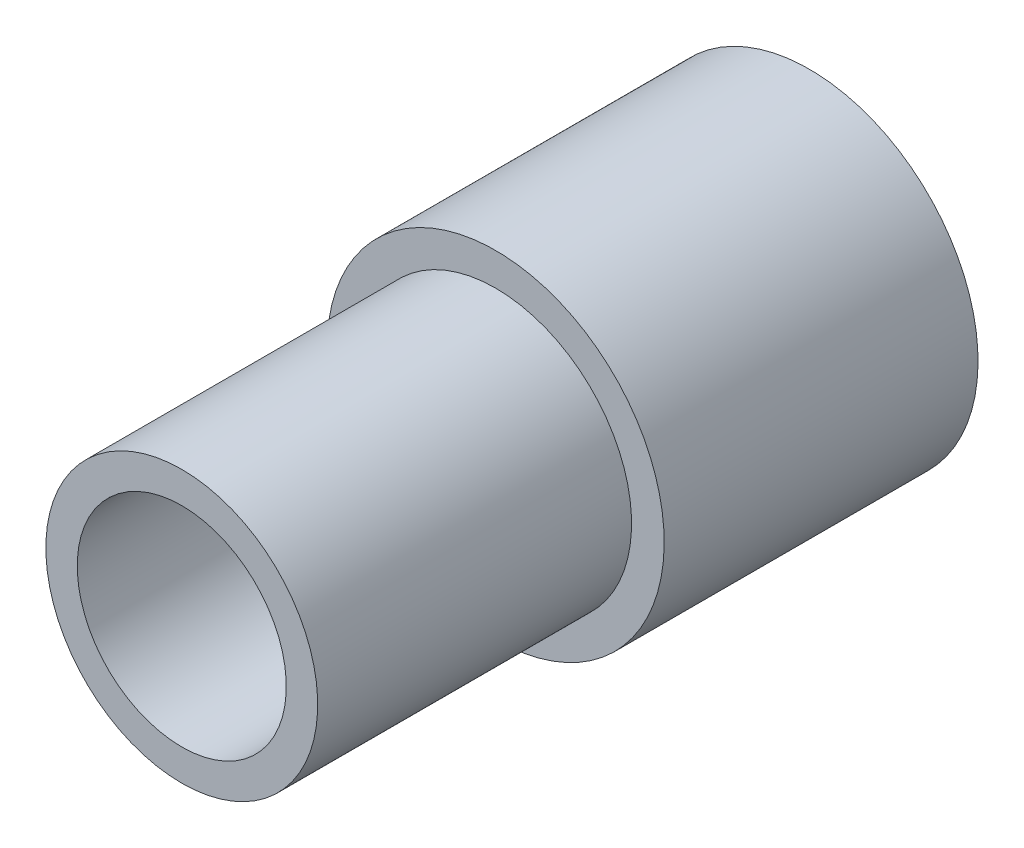
ISO-10303-21;
HEADER;
FILE_DESCRIPTION(('STEP AP214'),'2;1');
FILE_NAME('part.step','',(''),(''),'','','');
FILE_SCHEMA(('AUTOMOTIVE_DESIGN { 1 0 10303 214 1 1 1 1 }'));
ENDSEC;
DATA;
#1=APPLICATION_CONTEXT('core data for automotive mechanical design processes');
#2=APPLICATION_PROTOCOL_DEFINITION('international standard','automotive_design',2000,#1);
#3=PRODUCT_CONTEXT('',#1,'mechanical');
#4=PRODUCT('Part','Part','',(#3));
#5=PRODUCT_RELATED_PRODUCT_CATEGORY('part','',(#4));
#6=PRODUCT_DEFINITION_FORMATION('','',#4);
#7=PRODUCT_DEFINITION_CONTEXT('part definition',#1,'design');
#8=PRODUCT_DEFINITION('design','',#6,#7);
#9=PRODUCT_DEFINITION_SHAPE('','',#8);
#10=(LENGTH_UNIT() NAMED_UNIT(*) SI_UNIT(.MILLI.,.METRE.));
#11=(NAMED_UNIT(*) PLANE_ANGLE_UNIT() SI_UNIT($,.RADIAN.));
#12=(NAMED_UNIT(*) SI_UNIT($,.STERADIAN.) SOLID_ANGLE_UNIT());
#13=UNCERTAINTY_MEASURE_WITH_UNIT(LENGTH_MEASURE(1.E-05),#10,'distance_accuracy_value','');
#14=(GEOMETRIC_REPRESENTATION_CONTEXT(3) GLOBAL_UNCERTAINTY_ASSIGNED_CONTEXT((#13)) GLOBAL_UNIT_ASSIGNED_CONTEXT((#10,
#11,#12)) REPRESENTATION_CONTEXT('',''));
#15=CARTESIAN_POINT('',(0.,0.,0.));
#16=DIRECTION('',(0.,0.,1.));
#17=DIRECTION('',(1.,0.,0.));
#18=AXIS2_PLACEMENT_3D('',#15,#16,#17);
#19=CARTESIAN_POINT('',(0.,0.,-9.40475721120252));
#20=DIRECTION('',(0.,0.,1.));
#21=DIRECTION('',(0.,-1.,0.));
#22=AXIS2_PLACEMENT_3D('',#19,#20,#21);
#23=SPHERICAL_SURFACE('',#22,10.7033242137109);
#24=CARTESIAN_POINT('',(0.,0.,1.29856700250843));
#25=VERTEX_POINT('',#24);
#26=VERTEX_LOOP('',#25);
#27=FACE_BOUND('',#26,.T.);
#28=ADVANCED_FACE('F40',(#27),#23,.T.);
#29=CLOSED_SHELL('',(#28));
#30=MANIFOLD_SOLID_BREP('B2',#29);
#31=CARTESIAN_POINT('',(0.,11.,27.6550224338305));
#32=DIRECTION('',(0.,0.,-1.));
#33=DIRECTION('',(0.,1.,0.));
#34=AXIS2_PLACEMENT_3D('',#31,#32,#33);
#35=PLANE('',#34);
#36=CARTESIAN_POINT('',(0.,0.,27.6550224338305));
#37=DIRECTION('',(0.,0.,1.));
#38=DIRECTION('',(0.,-1.,0.));
#39=AXIS2_PLACEMENT_3D('',#36,#37,#38);
#40=CIRCLE('',#39,8.46);
#41=CARTESIAN_POINT('',(0.,-8.46,27.6550224338305));
#42=VERTEX_POINT('',#41);
#43=EDGE_CURVE('E39',#42,#42,#40,.T.);
#44=ORIENTED_EDGE('',*,*,#43,.F.);
#45=EDGE_LOOP('',(#44));
#46=FACE_BOUND('',#45,.T.);
#47=CARTESIAN_POINT('',(0.,0.,27.6550224338305));
#48=DIRECTION('',(0.,0.,1.));
#49=DIRECTION('',(0.,-1.,0.));
#50=AXIS2_PLACEMENT_3D('',#47,#48,#49);
#51=CIRCLE('',#50,11.);
#52=CARTESIAN_POINT('',(0.,-11.,27.6550224338305));
#53=VERTEX_POINT('',#52);
#54=EDGE_CURVE('E80',#53,#53,#51,.T.);
#55=ORIENTED_EDGE('',*,*,#54,.T.);
#56=EDGE_LOOP('',(#55));
#57=FACE_BOUND('',#56,.T.);
#58=ADVANCED_FACE('F52',(#46,#57),#35,.F.);
#59=CARTESIAN_POINT('',(0.,0.,27.6550224338305));
#60=DIRECTION('',(0.,0.,1.));
#61=DIRECTION('',(0.,-1.,0.));
#62=AXIS2_PLACEMENT_3D('',#59,#60,#61);
#63=CYLINDRICAL_SURFACE('',#62,8.46);
#64=CARTESIAN_POINT('',(0.,0.,-0.284977566169489));
#65=DIRECTION('',(0.,0.,1.));
#66=DIRECTION('',(0.,-1.,0.));
#67=AXIS2_PLACEMENT_3D('',#64,#65,#66);
#68=CIRCLE('',#67,8.45999999999999);
#69=CARTESIAN_POINT('',(0.,-8.45999999999999,-0.28497756616949));
#70=VERTEX_POINT('',#69);
#71=EDGE_CURVE('E58',#70,#70,#68,.T.);
#72=ORIENTED_EDGE('',*,*,#71,.F.);
#73=EDGE_LOOP('',(#72));
#74=FACE_BOUND('',#73,.T.);
#75=ORIENTED_EDGE('',*,*,#43,.T.);
#76=EDGE_LOOP('',(#75));
#77=FACE_BOUND('',#76,.T.);
#78=ADVANCED_FACE('F117',(#74,#77),#63,.F.);
#79=CARTESIAN_POINT('',(0.,8.46,-0.284977566169489));
#80=DIRECTION('',(0.,0.,1.));
#81=DIRECTION('',(0.,-1.,0.));
#82=AXIS2_PLACEMENT_3D('',#79,#80,#81);
#83=PLANE('',#82);
#84=CARTESIAN_POINT('',(0.,0.,-0.284977566169492));
#85=DIRECTION('',(0.,0.,1.));
#86=DIRECTION('',(0.,-1.,0.));
#87=AXIS2_PLACEMENT_3D('',#84,#85,#86);
#88=CIRCLE('',#87,11.1);
#89=CARTESIAN_POINT('',(0.,-11.1,-0.284977566169494));
#90=VERTEX_POINT('',#89);
#91=EDGE_CURVE('E62',#90,#90,#88,.T.);
#92=ORIENTED_EDGE('',*,*,#91,.F.);
#93=EDGE_LOOP('',(#92));
#94=FACE_BOUND('',#93,.T.);
#95=ORIENTED_EDGE('',*,*,#71,.T.);
#96=EDGE_LOOP('',(#95));
#97=FACE_BOUND('',#96,.T.);
#98=ADVANCED_FACE('F112',(#94,#97),#83,.F.);
#99=CARTESIAN_POINT('',(0.,0.,27.6550224338305));
#100=DIRECTION('',(0.,0.,1.));
#101=DIRECTION('',(0.,-1.,0.));
#102=AXIS2_PLACEMENT_3D('',#99,#100,#101);
#103=CYLINDRICAL_SURFACE('',#102,11.1);
#104=CARTESIAN_POINT('',(0.,0.,-23.1449775661695));
#105=DIRECTION('',(0.,0.,1.));
#106=DIRECTION('',(0.,-1.,0.));
#107=AXIS2_PLACEMENT_3D('',#104,#105,#106);
#108=CIRCLE('',#107,11.1);
#109=CARTESIAN_POINT('',(0.,-11.1,-23.1449775661695));
#110=VERTEX_POINT('',#109);
#111=EDGE_CURVE('E66',#110,#110,#108,.T.);
#112=ORIENTED_EDGE('',*,*,#111,.F.);
#113=EDGE_LOOP('',(#112));
#114=FACE_BOUND('',#113,.T.);
#115=ORIENTED_EDGE('',*,*,#91,.T.);
#116=EDGE_LOOP('',(#115));
#117=FACE_BOUND('',#116,.T.);
#118=ADVANCED_FACE('F106',(#114,#117),#103,.F.);
#119=CARTESIAN_POINT('',(0.,13.64,-23.1449775661695));
#120=DIRECTION('',(0.,0.,1.));
#121=DIRECTION('',(0.,-1.,0.));
#122=AXIS2_PLACEMENT_3D('',#119,#120,#121);
#123=PLANE('',#122);
#124=CARTESIAN_POINT('',(0.,0.,-23.1449775661695));
#125=DIRECTION('',(0.,0.,1.));
#126=DIRECTION('',(0.,-1.,0.));
#127=AXIS2_PLACEMENT_3D('',#124,#125,#126);
#128=CIRCLE('',#127,13.64);
#129=CARTESIAN_POINT('',(0.,-13.64,-23.1449775661695));
#130=VERTEX_POINT('',#129);
#131=EDGE_CURVE('E71',#130,#130,#128,.T.);
#132=ORIENTED_EDGE('',*,*,#131,.F.);
#133=EDGE_LOOP('',(#132));
#134=FACE_BOUND('',#133,.T.);
#135=ORIENTED_EDGE('',*,*,#111,.T.);
#136=EDGE_LOOP('',(#135));
#137=FACE_BOUND('',#136,.T.);
#138=ADVANCED_FACE('F100',(#134,#137),#123,.F.);
#139=CARTESIAN_POINT('',(0.,0.,27.6550224338305));
#140=DIRECTION('',(0.,0.,1.));
#141=DIRECTION('',(0.,-1.,0.));
#142=AXIS2_PLACEMENT_3D('',#139,#140,#141);
#143=CYLINDRICAL_SURFACE('',#142,13.64);
#144=CARTESIAN_POINT('',(0.,0.,2.25502243383051));
#145=DIRECTION('',(0.,0.,1.));
#146=DIRECTION('',(0.,-1.,0.));
#147=AXIS2_PLACEMENT_3D('',#144,#145,#146);
#148=CIRCLE('',#147,13.64);
#149=CARTESIAN_POINT('',(0.,-13.64,2.25502243383051));
#150=VERTEX_POINT('',#149);
#151=EDGE_CURVE('E74',#150,#150,#148,.T.);
#152=ORIENTED_EDGE('',*,*,#151,.F.);
#153=EDGE_LOOP('',(#152));
#154=FACE_BOUND('',#153,.T.);
#155=ORIENTED_EDGE('',*,*,#131,.T.);
#156=EDGE_LOOP('',(#155));
#157=FACE_BOUND('',#156,.T.);
#158=ADVANCED_FACE('F94',(#154,#157),#143,.T.);
#159=CARTESIAN_POINT('',(0.,11.,2.25502243383051));
#160=DIRECTION('',(0.,0.,-1.));
#161=DIRECTION('',(0.,1.,0.));
#162=AXIS2_PLACEMENT_3D('',#159,#160,#161);
#163=PLANE('',#162);
#164=CARTESIAN_POINT('',(0.,0.,2.25502243383051));
#165=DIRECTION('',(0.,0.,1.));
#166=DIRECTION('',(0.,-1.,0.));
#167=AXIS2_PLACEMENT_3D('',#164,#165,#166);
#168=CIRCLE('',#167,11.);
#169=CARTESIAN_POINT('',(0.,-11.,2.25502243383051));
#170=VERTEX_POINT('',#169);
#171=EDGE_CURVE('E77',#170,#170,#168,.T.);
#172=ORIENTED_EDGE('',*,*,#171,.F.);
#173=EDGE_LOOP('',(#172));
#174=FACE_BOUND('',#173,.T.);
#175=ORIENTED_EDGE('',*,*,#151,.T.);
#176=EDGE_LOOP('',(#175));
#177=FACE_BOUND('',#176,.T.);
#178=ADVANCED_FACE('F88',(#174,#177),#163,.F.);
#179=CARTESIAN_POINT('',(0.,0.,27.6550224338305));
#180=DIRECTION('',(0.,0.,1.));
#181=DIRECTION('',(0.,-1.,0.));
#182=AXIS2_PLACEMENT_3D('',#179,#180,#181);
#183=CYLINDRICAL_SURFACE('',#182,11.);
#184=ORIENTED_EDGE('',*,*,#54,.F.);
#185=EDGE_LOOP('',(#184));
#186=FACE_BOUND('',#185,.T.);
#187=ORIENTED_EDGE('',*,*,#171,.T.);
#188=EDGE_LOOP('',(#187));
#189=FACE_BOUND('',#188,.T.);
#190=ADVANCED_FACE('F85',(#186,#189),#183,.T.);
#191=CLOSED_SHELL('',(#58,#78,#98,#118,#138,#158,#178,#190));
#192=MANIFOLD_SOLID_BREP('B6',#191);
#193=ADVANCED_BREP_SHAPE_REPRESENTATION('',(#18,#30,#192),#14);
#194=SHAPE_DEFINITION_REPRESENTATION(#9,#193);
ENDSEC;
END-ISO-10303-21;
